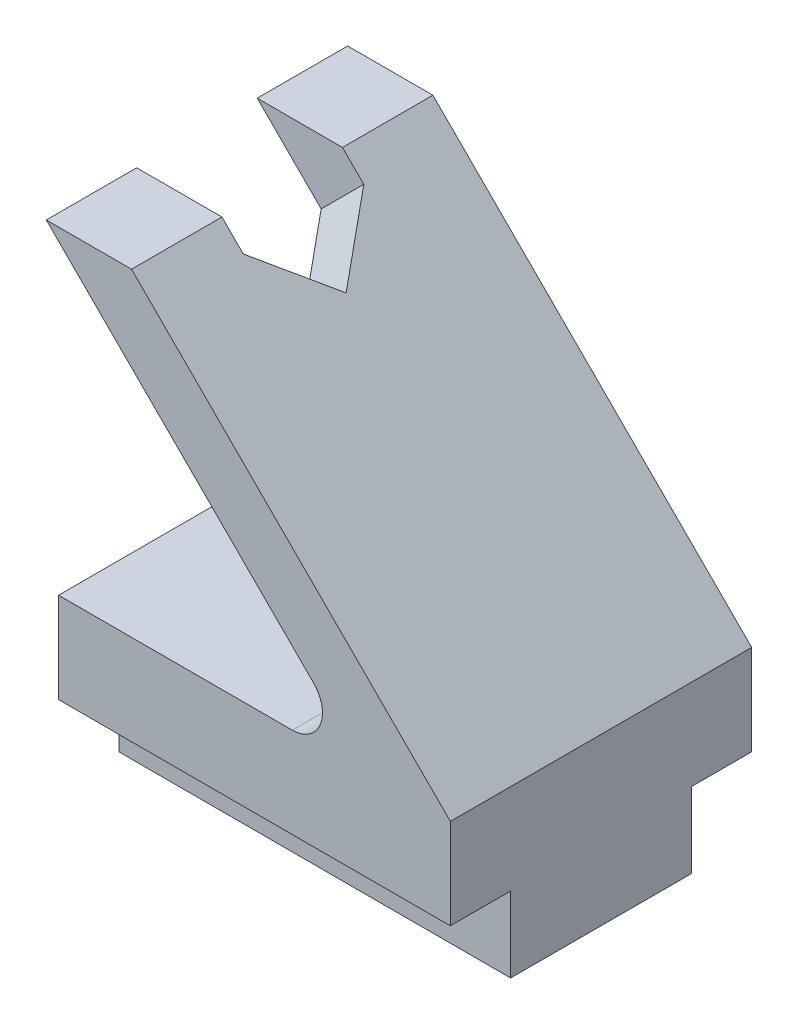
ISO-10303-21;
HEADER;
FILE_DESCRIPTION(('STEP AP214'),'2;1');
FILE_NAME('part.step','',(''),(''),'','','');
FILE_SCHEMA(('AUTOMOTIVE_DESIGN { 1 0 10303 214 1 1 1 1 }'));
ENDSEC;
DATA;
#1=APPLICATION_CONTEXT('core data for automotive mechanical design processes');
#2=APPLICATION_PROTOCOL_DEFINITION('international standard','automotive_design',2000,#1);
#3=PRODUCT_CONTEXT('',#1,'mechanical');
#4=PRODUCT('Part','Part','',(#3));
#5=PRODUCT_RELATED_PRODUCT_CATEGORY('part','',(#4));
#6=PRODUCT_DEFINITION_FORMATION('','',#4);
#7=PRODUCT_DEFINITION_CONTEXT('part definition',#1,'design');
#8=PRODUCT_DEFINITION('design','',#6,#7);
#9=PRODUCT_DEFINITION_SHAPE('','',#8);
#10=(LENGTH_UNIT() NAMED_UNIT(*) SI_UNIT(.MILLI.,.METRE.));
#11=(NAMED_UNIT(*) PLANE_ANGLE_UNIT() SI_UNIT($,.RADIAN.));
#12=(NAMED_UNIT(*) SI_UNIT($,.STERADIAN.) SOLID_ANGLE_UNIT());
#13=UNCERTAINTY_MEASURE_WITH_UNIT(LENGTH_MEASURE(1.E-05),#10,'distance_accuracy_value','');
#14=(GEOMETRIC_REPRESENTATION_CONTEXT(3) GLOBAL_UNCERTAINTY_ASSIGNED_CONTEXT((#13)) GLOBAL_UNIT_ASSIGNED_CONTEXT((#10,
#11,#12)) REPRESENTATION_CONTEXT('',''));
#15=CARTESIAN_POINT('',(0.,0.,0.));
#16=DIRECTION('',(0.,0.,1.));
#17=DIRECTION('',(1.,0.,0.));
#18=AXIS2_PLACEMENT_3D('',#15,#16,#17);
#19=CARTESIAN_POINT('',(9.68346258636508,64.3165374136345,-40.));
#20=DIRECTION('',(0.,1.,0.));
#21=DIRECTION('',(0.,0.,1.));
#22=AXIS2_PLACEMENT_3D('',#19,#20,#21);
#23=PLANE('',#22);
#24=DIRECTION('',(1.,0.,0.));
#25=VECTOR('',#24,1.);
#26=CARTESIAN_POINT('',(9.68346258636508,64.3165374136345,-12.));
#27=LINE('',#26,#25);
#28=CARTESIAN_POINT('',(-1.63024591261973,64.3165374136345,-12.));
#29=VERTEX_POINT('',#28);
#30=CARTESIAN_POINT('',(9.68346258636508,64.3165374136345,-12.));
#31=VERTEX_POINT('',#30);
#32=EDGE_CURVE('E204',#29,#31,#27,.T.);
#33=ORIENTED_EDGE('',*,*,#32,.F.);
#34=DIRECTION('',(0.,0.,1.));
#35=VECTOR('',#34,1.);
#36=CARTESIAN_POINT('',(-1.63024591261973,64.3165374136345,-40.));
#37=LINE('',#36,#35);
#38=CARTESIAN_POINT('',(-1.63024591261973,64.3165374136345,0.));
#39=VERTEX_POINT('',#38);
#40=EDGE_CURVE('E160',#29,#39,#37,.T.);
#41=ORIENTED_EDGE('',*,*,#40,.T.);
#42=DIRECTION('',(-1.,0.,0.));
#43=VECTOR('',#42,1.);
#44=CARTESIAN_POINT('',(9.68346258636508,64.3165374136345,0.));
#45=LINE('',#44,#43);
#46=CARTESIAN_POINT('',(9.68346258636508,64.3165374136345,0.));
#47=VERTEX_POINT('',#46);
#48=EDGE_CURVE('E269',#47,#39,#45,.T.);
#49=ORIENTED_EDGE('',*,*,#48,.F.);
#50=DIRECTION('',(0.,0.,1.));
#51=VECTOR('',#50,1.);
#52=CARTESIAN_POINT('',(9.68346258636508,64.3165374136345,-40.));
#53=LINE('',#52,#51);
#54=EDGE_CURVE('E161',#31,#47,#53,.T.);
#55=ORIENTED_EDGE('',*,*,#54,.F.);
#56=EDGE_LOOP('',(#33,#41,#49,#55));
#57=FACE_BOUND('',#56,.T.);
#58=ADVANCED_FACE('F31',(#57),#23,.T.);
#59=CARTESIAN_POINT('',(0.,0.,-40.));
#60=DIRECTION('',(-1.,0.,0.));
#61=DIRECTION('',(0.,0.,1.));
#62=AXIS2_PLACEMENT_3D('',#59,#60,#61);
#63=PLANE('',#62);
#64=DIRECTION('',(0.,0.,-1.));
#65=VECTOR('',#64,1.);
#66=CARTESIAN_POINT('',(0.,10.,-32.));
#67=LINE('',#66,#65);
#68=CARTESIAN_POINT('',(0.,10.,-32.));
#69=VERTEX_POINT('',#68);
#70=CARTESIAN_POINT('',(0.,10.,-40.));
#71=VERTEX_POINT('',#70);
#72=EDGE_CURVE('E219',#69,#71,#67,.T.);
#73=ORIENTED_EDGE('',*,*,#72,.F.);
#74=DIRECTION('',(0.,1.,0.));
#75=VECTOR('',#74,1.);
#76=CARTESIAN_POINT('',(0.,10.,-32.));
#77=LINE('',#76,#75);
#78=CARTESIAN_POINT('',(0.,0.,-32.));
#79=VERTEX_POINT('',#78);
#80=EDGE_CURVE('E211',#79,#69,#77,.T.);
#81=ORIENTED_EDGE('',*,*,#80,.F.);
#82=DIRECTION('',(0.,0.,1.));
#83=VECTOR('',#82,1.);
#84=CARTESIAN_POINT('',(0.,0.,-40.));
#85=LINE('',#84,#83);
#86=CARTESIAN_POINT('',(0.,0.,-8.));
#87=VERTEX_POINT('',#86);
#88=EDGE_CURVE('E184',#79,#87,#85,.T.);
#89=ORIENTED_EDGE('',*,*,#88,.T.);
#90=DIRECTION('',(0.,-1.,0.));
#91=VECTOR('',#90,1.);
#92=CARTESIAN_POINT('',(0.,0.,-8.));
#93=LINE('',#92,#91);
#94=CARTESIAN_POINT('',(0.,10.,-8.));
#95=VERTEX_POINT('',#94);
#96=EDGE_CURVE('E226',#95,#87,#93,.T.);
#97=ORIENTED_EDGE('',*,*,#96,.F.);
#98=DIRECTION('',(0.,0.,1.));
#99=VECTOR('',#98,1.);
#100=CARTESIAN_POINT('',(0.,10.,-8.));
#101=LINE('',#100,#99);
#102=CARTESIAN_POINT('',(0.,10.,0.));
#103=VERTEX_POINT('',#102);
#104=EDGE_CURVE('E239',#95,#103,#101,.T.);
#105=ORIENTED_EDGE('',*,*,#104,.T.);
#106=DIRECTION('',(0.,-1.,0.));
#107=VECTOR('',#106,1.);
#108=CARTESIAN_POINT('',(0.,0.,0.));
#109=LINE('',#108,#107);
#110=CARTESIAN_POINT('',(0.,22.,0.));
#111=VERTEX_POINT('',#110);
#112=EDGE_CURVE('E242',#111,#103,#109,.T.);
#113=ORIENTED_EDGE('',*,*,#112,.F.);
#114=DIRECTION('',(0.,0.,1.));
#115=VECTOR('',#114,1.);
#116=CARTESIAN_POINT('',(0.,22.,-40.));
#117=LINE('',#116,#115);
#118=CARTESIAN_POINT('',(0.,22.,-40.));
#119=VERTEX_POINT('',#118);
#120=EDGE_CURVE('E178',#119,#111,#117,.T.);
#121=ORIENTED_EDGE('',*,*,#120,.F.);
#122=DIRECTION('',(0.,-1.,0.));
#123=VECTOR('',#122,1.);
#124=CARTESIAN_POINT('',(0.,0.,-40.));
#125=LINE('',#124,#123);
#126=EDGE_CURVE('E244',#119,#71,#125,.T.);
#127=ORIENTED_EDGE('',*,*,#126,.T.);
#128=EDGE_LOOP('',(#73,#81,#89,#97,#105,#113,#121,#127));
#129=FACE_BOUND('',#128,.T.);
#130=ADVANCED_FACE('F33',(#129),#63,.T.);
#131=CARTESIAN_POINT('',(0.,22.,-40.));
#132=DIRECTION('',(0.,1.,0.));
#133=DIRECTION('',(0.,0.,1.));
#134=AXIS2_PLACEMENT_3D('',#131,#132,#133);
#135=PLANE('',#134);
#136=DIRECTION('',(-1.,0.,0.));
#137=VECTOR('',#136,1.);
#138=CARTESIAN_POINT('',(0.,22.,0.));
#139=LINE('',#138,#137);
#140=CARTESIAN_POINT('',(31.0294372515228,22.,0.));
#141=VERTEX_POINT('',#140);
#142=EDGE_CURVE('E248',#141,#111,#139,.T.);
#143=ORIENTED_EDGE('',*,*,#142,.F.);
#144=DIRECTION('',(0.,0.,1.));
#145=VECTOR('',#144,1.);
#146=CARTESIAN_POINT('',(31.0294372515228,22.,-40.));
#147=LINE('',#146,#145);
#148=CARTESIAN_POINT('',(31.0294372515228,22.,-40.));
#149=VERTEX_POINT('',#148);
#150=EDGE_CURVE('E181',#149,#141,#147,.T.);
#151=ORIENTED_EDGE('',*,*,#150,.F.);
#152=DIRECTION('',(-1.,0.,0.));
#153=VECTOR('',#152,1.);
#154=CARTESIAN_POINT('',(0.,22.,-40.));
#155=LINE('',#154,#153);
#156=EDGE_CURVE('E259',#149,#119,#155,.T.);
#157=ORIENTED_EDGE('',*,*,#156,.T.);
#158=ORIENTED_EDGE('',*,*,#120,.T.);
#159=EDGE_LOOP('',(#143,#151,#157,#158));
#160=FACE_BOUND('',#159,.T.);
#161=ADVANCED_FACE('F319',(#160),#135,.T.);
#162=CARTESIAN_POINT('',(31.0294372515229,26.,-40.));
#163=DIRECTION('',(0.,0.,1.));
#164=DIRECTION('',(1.,0.,0.));
#165=AXIS2_PLACEMENT_3D('',#162,#163,#164);
#166=CYLINDRICAL_SURFACE('',#165,3.99999999999999);
#167=CARTESIAN_POINT('',(31.0294372515229,26.,0.));
#168=DIRECTION('',(0.,0.,-1.));
#169=DIRECTION('',(-1.,0.,0.));
#170=AXIS2_PLACEMENT_3D('',#167,#168,#169);
#171=CIRCLE('',#170,3.99999999999999);
#172=CARTESIAN_POINT('',(33.857864376269,28.8284271247462,0.));
#173=VERTEX_POINT('',#172);
#174=EDGE_CURVE('E275',#173,#141,#171,.T.);
#175=ORIENTED_EDGE('',*,*,#174,.F.);
#176=DIRECTION('',(0.,0.,1.));
#177=VECTOR('',#176,1.);
#178=CARTESIAN_POINT('',(33.857864376269,28.8284271247462,-40.));
#179=LINE('',#178,#177);
#180=CARTESIAN_POINT('',(33.857864376269,28.8284271247462,-40.));
#181=VERTEX_POINT('',#180);
#182=EDGE_CURVE('E281',#181,#173,#179,.T.);
#183=ORIENTED_EDGE('',*,*,#182,.F.);
#184=CARTESIAN_POINT('',(31.0294372515229,26.,-40.));
#185=DIRECTION('',(0.,0.,-1.));
#186=DIRECTION('',(-1.,0.,0.));
#187=AXIS2_PLACEMENT_3D('',#184,#185,#186);
#188=CIRCLE('',#187,3.99999999999999);
#189=EDGE_CURVE('E256',#181,#149,#188,.T.);
#190=ORIENTED_EDGE('',*,*,#189,.T.);
#191=ORIENTED_EDGE('',*,*,#150,.T.);
#192=EDGE_LOOP('',(#175,#183,#190,#191));
#193=FACE_BOUND('',#192,.T.);
#194=ADVANCED_FACE('F328',(#193),#166,.F.);
#195=CARTESIAN_POINT('',(-1.63024591261973,64.3165374136345,-40.));
#196=DIRECTION('',(-0.707106781186544,-0.707106781186551,0.));
#197=DIRECTION('',(0.707106781186551,-0.707106781186544,0.));
#198=AXIS2_PLACEMENT_3D('',#195,#196,#197);
#199=PLANE('',#198);
#200=DIRECTION('',(-0.707106781186551,0.707106781186544,0.));
#201=VECTOR('',#200,1.);
#202=CARTESIAN_POINT('',(-1.63024591261973,64.3165374136345,-12.));
#203=LINE('',#202,#201);
#204=CARTESIAN_POINT('',(6.8550354616189,55.831256039396,-12.));
#205=VERTEX_POINT('',#204);
#206=EDGE_CURVE('E46',#205,#29,#203,.T.);
#207=ORIENTED_EDGE('',*,*,#206,.F.);
#208=DIRECTION('',(-0.500000000000003,0.499999999999997,0.707106781186548));
#209=VECTOR('',#208,1.);
#210=CARTESIAN_POINT('',(12.5118897111113,50.1744017899037,-20.));
#211=LINE('',#210,#209);
#212=CARTESIAN_POINT('',(12.5118897111113,50.1744017899036,-20.));
#213=VERTEX_POINT('',#212);
#214=EDGE_CURVE('E50',#213,#205,#211,.T.);
#215=ORIENTED_EDGE('',*,*,#214,.F.);
#216=DIRECTION('',(0.500000000000003,-0.499999999999997,0.707106781186548));
#217=VECTOR('',#216,1.);
#218=CARTESIAN_POINT('',(-1.63024591261972,64.3165374136345,-40.));
#219=LINE('',#218,#217);
#220=CARTESIAN_POINT('',(6.85503546161889,55.831256039396,-28.));
#221=VERTEX_POINT('',#220);
#222=EDGE_CURVE('E196',#221,#213,#219,.T.);
#223=ORIENTED_EDGE('',*,*,#222,.F.);
#224=DIRECTION('',(0.707106781186551,-0.707106781186544,0.));
#225=VECTOR('',#224,1.);
#226=CARTESIAN_POINT('',(-1.63024591261973,64.3165374136345,-28.));
#227=LINE('',#226,#225);
#228=CARTESIAN_POINT('',(-1.63024591261973,64.3165374136345,-28.));
#229=VERTEX_POINT('',#228);
#230=EDGE_CURVE('E170',#229,#221,#227,.T.);
#231=ORIENTED_EDGE('',*,*,#230,.F.);
#232=CARTESIAN_POINT('',(-1.63024591261973,64.3165374136345,-40.));
#233=VERTEX_POINT('',#232);
#234=EDGE_CURVE('E167',#233,#229,#37,.T.);
#235=ORIENTED_EDGE('',*,*,#234,.F.);
#236=DIRECTION('',(0.707106781186551,-0.707106781186544,0.));
#237=VECTOR('',#236,1.);
#238=CARTESIAN_POINT('',(-1.63024591261973,64.3165374136345,-40.));
#239=LINE('',#238,#237);
#240=EDGE_CURVE('E253',#233,#181,#239,.T.);
#241=ORIENTED_EDGE('',*,*,#240,.T.);
#242=ORIENTED_EDGE('',*,*,#182,.T.);
#243=DIRECTION('',(0.707106781186551,-0.707106781186544,0.));
#244=VECTOR('',#243,1.);
#245=CARTESIAN_POINT('',(-1.63024591261973,64.3165374136345,0.));
#246=LINE('',#245,#244);
#247=EDGE_CURVE('E272',#39,#173,#246,.T.);
#248=ORIENTED_EDGE('',*,*,#247,.F.);
#249=ORIENTED_EDGE('',*,*,#40,.F.);
#250=EDGE_LOOP('',(#207,#215,#223,#231,#235,#241,#242,#248,#249));
#251=FACE_BOUND('',#250,.T.);
#252=ADVANCED_FACE('F323',(#251),#199,.T.);
#253=DIRECTION('',(-1.,0.,0.));
#254=VECTOR('',#253,1.);
#255=CARTESIAN_POINT('',(9.68346258636508,64.3165374136345,-28.));
#256=LINE('',#255,#254);
#257=CARTESIAN_POINT('',(9.68346258636508,64.3165374136345,-28.));
#258=VERTEX_POINT('',#257);
#259=EDGE_CURVE('E165',#258,#229,#256,.T.);
#260=ORIENTED_EDGE('',*,*,#259,.F.);
#261=CARTESIAN_POINT('',(9.68346258636508,64.3165374136345,-40.));
#262=VERTEX_POINT('',#261);
#263=EDGE_CURVE('E148',#262,#258,#53,.T.);
#264=ORIENTED_EDGE('',*,*,#263,.F.);
#265=DIRECTION('',(-1.,0.,0.));
#266=VECTOR('',#265,1.);
#267=CARTESIAN_POINT('',(9.68346258636508,64.3165374136345,-40.));
#268=LINE('',#267,#266);
#269=EDGE_CURVE('E251',#262,#233,#268,.T.);
#270=ORIENTED_EDGE('',*,*,#269,.T.);
#271=ORIENTED_EDGE('',*,*,#234,.T.);
#272=EDGE_LOOP('',(#260,#264,#270,#271));
#273=FACE_BOUND('',#272,.T.);
#274=ADVANCED_FACE('F166',(#273),#23,.T.);
#275=CARTESIAN_POINT('',(52.0000000000001,22.0000000000001,-40.));
#276=DIRECTION('',(0.707106781186543,0.707106781186552,0.));
#277=DIRECTION('',(-0.707106781186552,0.707106781186543,0.));
#278=AXIS2_PLACEMENT_3D('',#275,#276,#277);
#279=PLANE('',#278);
#280=DIRECTION('',(0.707106781186552,-0.707106781186543,0.));
#281=VECTOR('',#280,1.);
#282=CARTESIAN_POINT('',(52.0000000000001,22.0000000000001,-12.));
#283=LINE('',#282,#281);
#284=CARTESIAN_POINT('',(12.5118897111112,61.4881102888884,-12.));
#285=VERTEX_POINT('',#284);
#286=EDGE_CURVE('E11',#31,#285,#283,.T.);
#287=ORIENTED_EDGE('',*,*,#286,.F.);
#288=ORIENTED_EDGE('',*,*,#54,.T.);
#289=DIRECTION('',(-0.707106781186552,0.707106781186543,0.));
#290=VECTOR('',#289,1.);
#291=CARTESIAN_POINT('',(52.0000000000001,22.0000000000001,0.));
#292=LINE('',#291,#290);
#293=CARTESIAN_POINT('',(52.0000000000001,22.0000000000001,0.));
#294=VERTEX_POINT('',#293);
#295=EDGE_CURVE('E266',#294,#47,#292,.T.);
#296=ORIENTED_EDGE('',*,*,#295,.F.);
#297=DIRECTION('',(0.,0.,1.));
#298=VECTOR('',#297,1.);
#299=CARTESIAN_POINT('',(52.0000000000001,22.0000000000001,-40.));
#300=LINE('',#299,#298);
#301=CARTESIAN_POINT('',(52.0000000000001,22.0000000000001,-40.));
#302=VERTEX_POINT('',#301);
#303=EDGE_CURVE('E284',#302,#294,#300,.T.);
#304=ORIENTED_EDGE('',*,*,#303,.F.);
#305=DIRECTION('',(-0.707106781186552,0.707106781186543,0.));
#306=VECTOR('',#305,1.);
#307=CARTESIAN_POINT('',(52.0000000000001,22.0000000000001,-40.));
#308=LINE('',#307,#306);
#309=EDGE_CURVE('E156',#302,#262,#308,.T.);
#310=ORIENTED_EDGE('',*,*,#309,.T.);
#311=ORIENTED_EDGE('',*,*,#263,.T.);
#312=DIRECTION('',(-0.707106781186552,0.707106781186543,0.));
#313=VECTOR('',#312,1.);
#314=CARTESIAN_POINT('',(52.0000000000001,22.0000000000001,-28.));
#315=LINE('',#314,#313);
#316=CARTESIAN_POINT('',(12.5118897111112,61.4881102888884,-28.));
#317=VERTEX_POINT('',#316);
#318=EDGE_CURVE('E152',#317,#258,#315,.T.);
#319=ORIENTED_EDGE('',*,*,#318,.F.);
#320=DIRECTION('',(-0.500000000000003,0.499999999999997,-0.707106781186548));
#321=VECTOR('',#320,1.);
#322=CARTESIAN_POINT('',(28.0133041684363,45.9866958315635,-6.07768943848462));
#323=LINE('',#322,#321);
#324=CARTESIAN_POINT('',(18.1687439606037,55.8312560393961,-20.));
#325=VERTEX_POINT('',#324);
#326=EDGE_CURVE('E177',#325,#317,#323,.T.);
#327=ORIENTED_EDGE('',*,*,#326,.F.);
#328=DIRECTION('',(0.500000000000003,-0.499999999999997,-0.707106781186547));
#329=VECTOR('',#328,1.);
#330=CARTESIAN_POINT('',(42.1554397921674,31.8445602078326,-53.9223105615154));
#331=LINE('',#330,#329);
#332=EDGE_CURVE('E39',#285,#325,#331,.T.);
#333=ORIENTED_EDGE('',*,*,#332,.F.);
#334=EDGE_LOOP('',(#287,#288,#296,#304,#310,#311,#319,#327,#333));
#335=FACE_BOUND('',#334,.T.);
#336=ADVANCED_FACE('F150',(#335),#279,.T.);
#337=CARTESIAN_POINT('',(52.,0.,-40.));
#338=DIRECTION('',(1.,0.,0.));
#339=DIRECTION('',(0.,1.,0.));
#340=AXIS2_PLACEMENT_3D('',#337,#338,#339);
#341=PLANE('',#340);
#342=DIRECTION('',(0.,0.,-1.));
#343=VECTOR('',#342,1.);
#344=CARTESIAN_POINT('',(52.,10.,-32.));
#345=LINE('',#344,#343);
#346=CARTESIAN_POINT('',(52.,10.,-32.));
#347=VERTEX_POINT('',#346);
#348=CARTESIAN_POINT('',(52.,10.,-40.));
#349=VERTEX_POINT('',#348);
#350=EDGE_CURVE('E221',#347,#349,#345,.T.);
#351=ORIENTED_EDGE('',*,*,#350,.T.);
#352=DIRECTION('',(0.,1.,0.));
#353=VECTOR('',#352,1.);
#354=CARTESIAN_POINT('',(52.,0.,-40.));
#355=LINE('',#354,#353);
#356=EDGE_CURVE('E247',#349,#302,#355,.T.);
#357=ORIENTED_EDGE('',*,*,#356,.T.);
#358=ORIENTED_EDGE('',*,*,#303,.T.);
#359=DIRECTION('',(0.,1.,0.));
#360=VECTOR('',#359,1.);
#361=CARTESIAN_POINT('',(52.,0.,0.));
#362=LINE('',#361,#360);
#363=CARTESIAN_POINT('',(52.,10.,0.));
#364=VERTEX_POINT('',#363);
#365=EDGE_CURVE('E264',#364,#294,#362,.T.);
#366=ORIENTED_EDGE('',*,*,#365,.F.);
#367=DIRECTION('',(0.,0.,1.));
#368=VECTOR('',#367,1.);
#369=CARTESIAN_POINT('',(52.,10.,-8.));
#370=LINE('',#369,#368);
#371=CARTESIAN_POINT('',(52.,10.,-8.));
#372=VERTEX_POINT('',#371);
#373=EDGE_CURVE('E237',#372,#364,#370,.T.);
#374=ORIENTED_EDGE('',*,*,#373,.F.);
#375=DIRECTION('',(0.,1.,0.));
#376=VECTOR('',#375,1.);
#377=CARTESIAN_POINT('',(52.,10.,-8.));
#378=LINE('',#377,#376);
#379=CARTESIAN_POINT('',(52.,0.,-8.));
#380=VERTEX_POINT('',#379);
#381=EDGE_CURVE('E232',#380,#372,#378,.T.);
#382=ORIENTED_EDGE('',*,*,#381,.F.);
#383=DIRECTION('',(0.,0.,1.));
#384=VECTOR('',#383,1.);
#385=CARTESIAN_POINT('',(52.,0.,-40.));
#386=LINE('',#385,#384);
#387=CARTESIAN_POINT('',(52.,0.,-32.));
#388=VERTEX_POINT('',#387);
#389=EDGE_CURVE('E286',#388,#380,#386,.T.);
#390=ORIENTED_EDGE('',*,*,#389,.F.);
#391=DIRECTION('',(0.,-1.,0.));
#392=VECTOR('',#391,1.);
#393=CARTESIAN_POINT('',(52.,0.,-32.));
#394=LINE('',#393,#392);
#395=EDGE_CURVE('E217',#347,#388,#394,.T.);
#396=ORIENTED_EDGE('',*,*,#395,.F.);
#397=EDGE_LOOP('',(#351,#357,#358,#366,#374,#382,#390,#396));
#398=FACE_BOUND('',#397,.T.);
#399=ADVANCED_FACE('F303',(#398),#341,.T.);
#400=CARTESIAN_POINT('',(0.,0.,-40.));
#401=DIRECTION('',(0.,-1.,0.));
#402=DIRECTION('',(0.,0.,-1.));
#403=AXIS2_PLACEMENT_3D('',#400,#401,#402);
#404=PLANE('',#403);
#405=DIRECTION('',(-1.,0.,0.));
#406=VECTOR('',#405,1.);
#407=CARTESIAN_POINT('',(0.,0.,-32.));
#408=LINE('',#407,#406);
#409=EDGE_CURVE('E209',#388,#79,#408,.T.);
#410=ORIENTED_EDGE('',*,*,#409,.F.);
#411=ORIENTED_EDGE('',*,*,#389,.T.);
#412=DIRECTION('',(1.,0.,0.));
#413=VECTOR('',#412,1.);
#414=CARTESIAN_POINT('',(0.,0.,-8.));
#415=LINE('',#414,#413);
#416=EDGE_CURVE('E229',#87,#380,#415,.T.);
#417=ORIENTED_EDGE('',*,*,#416,.F.);
#418=ORIENTED_EDGE('',*,*,#88,.F.);
#419=EDGE_LOOP('',(#410,#411,#417,#418));
#420=FACE_BOUND('',#419,.T.);
#421=ADVANCED_FACE('F300',(#420),#404,.T.);
#422=CARTESIAN_POINT('',(31.0294372515229,26.,-40.));
#423=DIRECTION('',(0.,0.,-1.));
#424=DIRECTION('',(-1.,0.,0.));
#425=AXIS2_PLACEMENT_3D('',#422,#423,#424);
#426=PLANE('',#425);
#427=DIRECTION('',(1.,0.,0.));
#428=VECTOR('',#427,1.);
#429=CARTESIAN_POINT('',(52.,10.,-40.));
#430=LINE('',#429,#428);
#431=EDGE_CURVE('E208',#71,#349,#430,.T.);
#432=ORIENTED_EDGE('',*,*,#431,.F.);
#433=ORIENTED_EDGE('',*,*,#126,.F.);
#434=ORIENTED_EDGE('',*,*,#156,.F.);
#435=ORIENTED_EDGE('',*,*,#189,.F.);
#436=ORIENTED_EDGE('',*,*,#240,.F.);
#437=ORIENTED_EDGE('',*,*,#269,.F.);
#438=ORIENTED_EDGE('',*,*,#309,.F.);
#439=ORIENTED_EDGE('',*,*,#356,.F.);
#440=EDGE_LOOP('',(#432,#433,#434,#435,#436,#437,#438,#439));
#441=FACE_BOUND('',#440,.T.);
#442=ADVANCED_FACE('F302',(#441),#426,.T.);
#443=CARTESIAN_POINT('',(31.0294372515229,26.,0.));
#444=DIRECTION('',(0.,0.,-1.));
#445=DIRECTION('',(-1.,0.,0.));
#446=AXIS2_PLACEMENT_3D('',#443,#444,#445);
#447=PLANE('',#446);
#448=ORIENTED_EDGE('',*,*,#112,.T.);
#449=DIRECTION('',(-1.,0.,0.));
#450=VECTOR('',#449,1.);
#451=CARTESIAN_POINT('',(0.,10.,0.));
#452=LINE('',#451,#450);
#453=EDGE_CURVE('E224',#364,#103,#452,.T.);
#454=ORIENTED_EDGE('',*,*,#453,.F.);
#455=ORIENTED_EDGE('',*,*,#365,.T.);
#456=ORIENTED_EDGE('',*,*,#295,.T.);
#457=ORIENTED_EDGE('',*,*,#48,.T.);
#458=ORIENTED_EDGE('',*,*,#247,.T.);
#459=ORIENTED_EDGE('',*,*,#174,.T.);
#460=ORIENTED_EDGE('',*,*,#142,.T.);
#461=EDGE_LOOP('',(#448,#454,#455,#456,#457,#458,#459,#460));
#462=FACE_BOUND('',#461,.T.);
#463=ADVANCED_FACE('F308',(#462),#447,.F.);
#464=CARTESIAN_POINT('',(0.,10.,-8.));
#465=DIRECTION('',(0.,1.,0.));
#466=DIRECTION('',(0.,0.,1.));
#467=AXIS2_PLACEMENT_3D('',#464,#465,#466);
#468=PLANE('',#467);
#469=ORIENTED_EDGE('',*,*,#453,.T.);
#470=ORIENTED_EDGE('',*,*,#104,.F.);
#471=DIRECTION('',(-1.,0.,0.));
#472=VECTOR('',#471,1.);
#473=CARTESIAN_POINT('',(0.,10.,-8.));
#474=LINE('',#473,#472);
#475=EDGE_CURVE('E234',#372,#95,#474,.T.);
#476=ORIENTED_EDGE('',*,*,#475,.F.);
#477=ORIENTED_EDGE('',*,*,#373,.T.);
#478=EDGE_LOOP('',(#469,#470,#476,#477));
#479=FACE_BOUND('',#478,.T.);
#480=ADVANCED_FACE('F339',(#479),#468,.F.);
#481=CARTESIAN_POINT('',(0.,10.,-8.));
#482=DIRECTION('',(0.,0.,-1.));
#483=DIRECTION('',(-1.,0.,0.));
#484=AXIS2_PLACEMENT_3D('',#481,#482,#483);
#485=PLANE('',#484);
#486=ORIENTED_EDGE('',*,*,#96,.T.);
#487=ORIENTED_EDGE('',*,*,#416,.T.);
#488=ORIENTED_EDGE('',*,*,#381,.T.);
#489=ORIENTED_EDGE('',*,*,#475,.T.);
#490=EDGE_LOOP('',(#486,#487,#488,#489));
#491=FACE_BOUND('',#490,.T.);
#492=ADVANCED_FACE('F297',(#491),#485,.F.);
#493=CARTESIAN_POINT('',(52.,10.,-32.));
#494=DIRECTION('',(0.,1.,0.));
#495=DIRECTION('',(0.,0.,1.));
#496=AXIS2_PLACEMENT_3D('',#493,#494,#495);
#497=PLANE('',#496);
#498=ORIENTED_EDGE('',*,*,#431,.T.);
#499=ORIENTED_EDGE('',*,*,#350,.F.);
#500=DIRECTION('',(1.,0.,0.));
#501=VECTOR('',#500,1.);
#502=CARTESIAN_POINT('',(52.,10.,-32.));
#503=LINE('',#502,#501);
#504=EDGE_CURVE('E214',#69,#347,#503,.T.);
#505=ORIENTED_EDGE('',*,*,#504,.F.);
#506=ORIENTED_EDGE('',*,*,#72,.T.);
#507=EDGE_LOOP('',(#498,#499,#505,#506));
#508=FACE_BOUND('',#507,.T.);
#509=ADVANCED_FACE('F347',(#508),#497,.F.);
#510=CARTESIAN_POINT('',(52.,0.,-32.));
#511=DIRECTION('',(0.,0.,1.));
#512=DIRECTION('',(1.,0.,0.));
#513=AXIS2_PLACEMENT_3D('',#510,#511,#512);
#514=PLANE('',#513);
#515=ORIENTED_EDGE('',*,*,#409,.T.);
#516=ORIENTED_EDGE('',*,*,#80,.T.);
#517=ORIENTED_EDGE('',*,*,#504,.T.);
#518=ORIENTED_EDGE('',*,*,#395,.T.);
#519=EDGE_LOOP('',(#515,#516,#517,#518));
#520=FACE_BOUND('',#519,.T.);
#521=ADVANCED_FACE('F350',(#520),#514,.F.);
#522=CARTESIAN_POINT('',(-118.002446450552,-52.0556631242988,-12.));
#523=DIRECTION('',(0.,0.,1.));
#524=DIRECTION('',(1.,0.,0.));
#525=AXIS2_PLACEMENT_3D('',#522,#523,#524);
#526=PLANE('',#525);
#527=DIRECTION('',(0.707106781186543,0.707106781186552,0.));
#528=VECTOR('',#527,1.);
#529=CARTESIAN_POINT('',(-109.517165076313,-60.5409444985373,-12.));
#530=LINE('',#529,#528);
#531=EDGE_CURVE('E171',#205,#285,#530,.T.);
#532=ORIENTED_EDGE('',*,*,#531,.F.);
#533=ORIENTED_EDGE('',*,*,#206,.T.);
#534=ORIENTED_EDGE('',*,*,#32,.T.);
#535=ORIENTED_EDGE('',*,*,#286,.T.);
#536=EDGE_LOOP('',(#532,#533,#534,#535));
#537=FACE_BOUND('',#536,.T.);
#538=ADVANCED_FACE('F354',(#537),#526,.F.);
#539=CARTESIAN_POINT('',(-109.517165076313,-60.5409444985373,-12.));
#540=DIRECTION('',(0.500000000000003,-0.499999999999997,0.707106781186548));
#541=DIRECTION('',(0.816496580927724,0.,-0.577350269189628));
#542=AXIS2_PLACEMENT_3D('',#539,#540,#541);
#543=PLANE('',#542);
#544=DIRECTION('',(0.707106781186543,0.707106781186552,0.));
#545=VECTOR('',#544,1.);
#546=CARTESIAN_POINT('',(-103.860310826821,-66.1977987480297,-20.));
#547=LINE('',#546,#545);
#548=EDGE_CURVE('E192',#213,#325,#547,.T.);
#549=ORIENTED_EDGE('',*,*,#548,.F.);
#550=ORIENTED_EDGE('',*,*,#214,.T.);
#551=ORIENTED_EDGE('',*,*,#531,.T.);
#552=ORIENTED_EDGE('',*,*,#332,.T.);
#553=EDGE_LOOP('',(#549,#550,#551,#552));
#554=FACE_BOUND('',#553,.T.);
#555=ADVANCED_FACE('F191',(#554),#543,.F.);
#556=CARTESIAN_POINT('',(-103.860310826821,-66.1977987480297,-20.));
#557=DIRECTION('',(0.500000000000003,-0.499999999999997,-0.707106781186547));
#558=DIRECTION('',(-0.816496580927724,0.,-0.577350269189628));
#559=AXIS2_PLACEMENT_3D('',#556,#557,#558);
#560=PLANE('',#559);
#561=DIRECTION('',(0.707106781186543,0.707106781186552,0.));
#562=VECTOR('',#561,1.);
#563=CARTESIAN_POINT('',(-109.517165076313,-60.5409444985373,-28.));
#564=LINE('',#563,#562);
#565=EDGE_CURVE('E176',#221,#317,#564,.T.);
#566=ORIENTED_EDGE('',*,*,#565,.F.);
#567=ORIENTED_EDGE('',*,*,#222,.T.);
#568=ORIENTED_EDGE('',*,*,#548,.T.);
#569=ORIENTED_EDGE('',*,*,#326,.T.);
#570=EDGE_LOOP('',(#566,#567,#568,#569));
#571=FACE_BOUND('',#570,.T.);
#572=ADVANCED_FACE('F195',(#571),#560,.F.);
#573=CARTESIAN_POINT('',(-109.517165076313,-60.5409444985373,-28.));
#574=DIRECTION('',(0.,0.,-1.));
#575=DIRECTION('',(-1.,0.,0.));
#576=AXIS2_PLACEMENT_3D('',#573,#574,#575);
#577=PLANE('',#576);
#578=ORIENTED_EDGE('',*,*,#259,.T.);
#579=ORIENTED_EDGE('',*,*,#230,.T.);
#580=ORIENTED_EDGE('',*,*,#565,.T.);
#581=ORIENTED_EDGE('',*,*,#318,.T.);
#582=EDGE_LOOP('',(#578,#579,#580,#581));
#583=FACE_BOUND('',#582,.T.);
#584=ADVANCED_FACE('F174',(#583),#577,.F.);
#585=CLOSED_SHELL('',(#58,#130,#161,#194,#252,#274,#336,#399,#421,#442,#463,#480,#492,#509,#521,
#538,#555,#572,#584));
#586=MANIFOLD_SOLID_BREP('B2',#585);
#587=ADVANCED_BREP_SHAPE_REPRESENTATION('',(#18,#586),#14);
#588=SHAPE_DEFINITION_REPRESENTATION(#9,#587);
ENDSEC;
END-ISO-10303-21;
